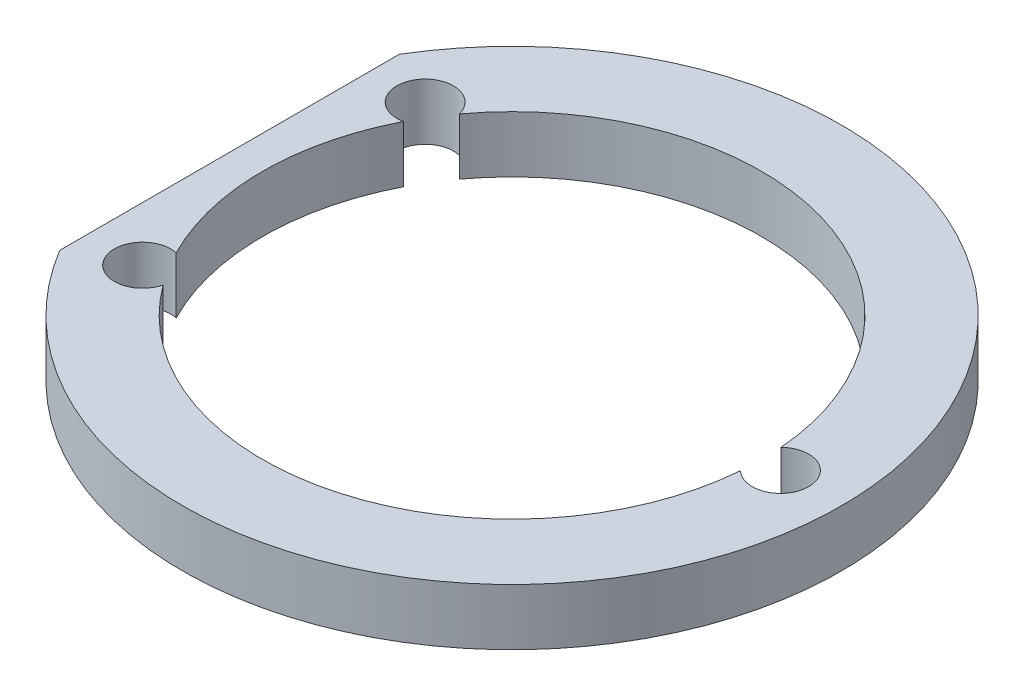
ISO-10303-21;
HEADER;
FILE_DESCRIPTION(('STEP AP214'),'2;1');
FILE_NAME('part.step','',(''),(''),'','','');
FILE_SCHEMA(('AUTOMOTIVE_DESIGN { 1 0 10303 214 1 1 1 1 }'));
ENDSEC;
DATA;
#1=APPLICATION_CONTEXT('core data for automotive mechanical design processes');
#2=APPLICATION_PROTOCOL_DEFINITION('international standard','automotive_design',2000,#1);
#3=PRODUCT_CONTEXT('',#1,'mechanical');
#4=PRODUCT('Part','Part','',(#3));
#5=PRODUCT_RELATED_PRODUCT_CATEGORY('part','',(#4));
#6=PRODUCT_DEFINITION_FORMATION('','',#4);
#7=PRODUCT_DEFINITION_CONTEXT('part definition',#1,'design');
#8=PRODUCT_DEFINITION('design','',#6,#7);
#9=PRODUCT_DEFINITION_SHAPE('','',#8);
#10=(LENGTH_UNIT() NAMED_UNIT(*) SI_UNIT(.MILLI.,.METRE.));
#11=(NAMED_UNIT(*) PLANE_ANGLE_UNIT() SI_UNIT($,.RADIAN.));
#12=(NAMED_UNIT(*) SI_UNIT($,.STERADIAN.) SOLID_ANGLE_UNIT());
#13=UNCERTAINTY_MEASURE_WITH_UNIT(LENGTH_MEASURE(1.E-05),#10,'distance_accuracy_value','');
#14=(GEOMETRIC_REPRESENTATION_CONTEXT(3) GLOBAL_UNCERTAINTY_ASSIGNED_CONTEXT((#13)) GLOBAL_UNIT_ASSIGNED_CONTEXT((#10,
#11,#12)) REPRESENTATION_CONTEXT('',''));
#15=CARTESIAN_POINT('',(0.,0.,0.));
#16=DIRECTION('',(0.,0.,1.));
#17=DIRECTION('',(1.,0.,0.));
#18=AXIS2_PLACEMENT_3D('',#15,#16,#17);
#19=CARTESIAN_POINT('',(0.,6.,0.));
#20=DIRECTION('',(0.,1.,0.));
#21=DIRECTION('',(0.,0.,1.));
#22=AXIS2_PLACEMENT_3D('',#19,#20,#21);
#23=PLANE('',#22);
#24=CARTESIAN_POINT('',(0.,6.,0.));
#25=DIRECTION('',(0.,1.,0.));
#26=DIRECTION('',(0.,0.,1.));
#27=AXIS2_PLACEMENT_3D('',#24,#25,#26);
#28=CIRCLE('',#27,35.);
#29=CARTESIAN_POINT('',(-30.,6.,18.02775637732));
#30=VERTEX_POINT('',#29);
#31=CARTESIAN_POINT('',(-30.,6.,-18.02775637732));
#32=VERTEX_POINT('',#31);
#33=EDGE_CURVE('E148',#30,#32,#28,.T.);
#34=ORIENTED_EDGE('',*,*,#33,.T.);
#35=DIRECTION('',(0.,0.,1.));
#36=VECTOR('',#35,1.);
#37=CARTESIAN_POINT('',(-30.,6.,-18.02775637732));
#38=LINE('',#37,#36);
#39=EDGE_CURVE('E151',#32,#30,#38,.T.);
#40=ORIENTED_EDGE('',*,*,#39,.T.);
#41=EDGE_LOOP('',(#34,#40));
#42=FACE_BOUND('',#41,.T.);
#43=CARTESIAN_POINT('',(-24.2332416321053,6.,-15.));
#44=DIRECTION('',(0.,1.,0.));
#45=DIRECTION('',(0.,0.,1.));
#46=AXIS2_PLACEMENT_3D('',#43,#44,#45);
#47=CIRCLE('',#46,3.);
#48=CARTESIAN_POINT('',(-21.3241831364564,6.,-15.7330611631325));
#49=VERTEX_POINT('',#48);
#50=CARTESIAN_POINT('',(-23.5919698670948,6.,-12.0693395755563));
#51=VERTEX_POINT('',#50);
#52=EDGE_CURVE('E105',#49,#51,#47,.T.);
#53=ORIENTED_EDGE('',*,*,#52,.F.);
#54=CARTESIAN_POINT('',(0.,6.,0.));
#55=DIRECTION('',(0.,1.,0.));
#56=DIRECTION('',(0.,0.,1.));
#57=AXIS2_PLACEMENT_3D('',#54,#55,#56);
#58=CIRCLE('',#57,26.5);
#59=CARTESIAN_POINT('',(26.4122807017544,6.,-2.15439739410649));
#60=VERTEX_POINT('',#59);
#61=EDGE_CURVE('E97',#60,#49,#58,.T.);
#62=ORIENTED_EDGE('',*,*,#61,.F.);
#63=CARTESIAN_POINT('',(28.5,6.,0.));
#64=DIRECTION('',(0.,1.,0.));
#65=DIRECTION('',(0.,0.,1.));
#66=AXIS2_PLACEMENT_3D('',#63,#64,#65);
#67=CIRCLE('',#66,3.);
#68=CARTESIAN_POINT('',(26.4122807017544,6.,2.15439739410649));
#69=VERTEX_POINT('',#68);
#70=EDGE_CURVE('E126',#69,#60,#67,.T.);
#71=ORIENTED_EDGE('',*,*,#70,.F.);
#72=CARTESIAN_POINT('',(0.,6.,0.));
#73=DIRECTION('',(0.,1.,0.));
#74=DIRECTION('',(0.,0.,1.));
#75=AXIS2_PLACEMENT_3D('',#72,#73,#74);
#76=CIRCLE('',#75,26.5);
#77=CARTESIAN_POINT('',(-21.3241831364564,6.,15.7330611631325));
#78=VERTEX_POINT('',#77);
#79=EDGE_CURVE('E124',#78,#69,#76,.T.);
#80=ORIENTED_EDGE('',*,*,#79,.F.);
#81=CARTESIAN_POINT('',(-24.2332416321053,6.,15.));
#82=DIRECTION('',(0.,1.,0.));
#83=DIRECTION('',(0.,0.,-1.));
#84=AXIS2_PLACEMENT_3D('',#81,#82,#83);
#85=CIRCLE('',#84,3.);
#86=CARTESIAN_POINT('',(-23.5919698670948,6.,12.0693395755563));
#87=VERTEX_POINT('',#86);
#88=EDGE_CURVE('E120',#87,#78,#85,.T.);
#89=ORIENTED_EDGE('',*,*,#88,.F.);
#90=CARTESIAN_POINT('',(0.,6.,0.));
#91=DIRECTION('',(0.,1.,0.));
#92=DIRECTION('',(0.,0.,1.));
#93=AXIS2_PLACEMENT_3D('',#90,#91,#92);
#94=CIRCLE('',#93,26.5);
#95=EDGE_CURVE('E118',#51,#87,#94,.T.);
#96=ORIENTED_EDGE('',*,*,#95,.F.);
#97=EDGE_LOOP('',(#53,#62,#71,#80,#89,#96));
#98=FACE_BOUND('',#97,.T.);
#99=ADVANCED_FACE('F32',(#42,#98),#23,.T.);
#100=CARTESIAN_POINT('',(0.,0.,0.));
#101=DIRECTION('',(0.,1.,0.));
#102=DIRECTION('',(0.,0.,1.));
#103=AXIS2_PLACEMENT_3D('',#100,#101,#102);
#104=PLANE('',#103);
#105=CARTESIAN_POINT('',(0.,0.,0.));
#106=DIRECTION('',(0.,1.,0.));
#107=DIRECTION('',(0.,0.,1.));
#108=AXIS2_PLACEMENT_3D('',#105,#106,#107);
#109=CIRCLE('',#108,35.);
#110=CARTESIAN_POINT('',(-30.,0.,18.02775637732));
#111=VERTEX_POINT('',#110);
#112=CARTESIAN_POINT('',(-30.,0.,-18.02775637732));
#113=VERTEX_POINT('',#112);
#114=EDGE_CURVE('E113',#111,#113,#109,.T.);
#115=ORIENTED_EDGE('',*,*,#114,.F.);
#116=DIRECTION('',(0.,0.,1.));
#117=VECTOR('',#116,1.);
#118=CARTESIAN_POINT('',(-30.,0.,-18.02775637732));
#119=LINE('',#118,#117);
#120=EDGE_CURVE('E152',#113,#111,#119,.T.);
#121=ORIENTED_EDGE('',*,*,#120,.F.);
#122=EDGE_LOOP('',(#115,#121));
#123=FACE_BOUND('',#122,.T.);
#124=CARTESIAN_POINT('',(0.,0.,0.));
#125=DIRECTION('',(0.,1.,0.));
#126=DIRECTION('',(0.,0.,1.));
#127=AXIS2_PLACEMENT_3D('',#124,#125,#126);
#128=CIRCLE('',#127,26.5);
#129=CARTESIAN_POINT('',(26.4122807017544,0.,-2.15439739410649));
#130=VERTEX_POINT('',#129);
#131=CARTESIAN_POINT('',(-21.3241831364564,0.,-15.7330611631325));
#132=VERTEX_POINT('',#131);
#133=EDGE_CURVE('E55',#130,#132,#128,.T.);
#134=ORIENTED_EDGE('',*,*,#133,.T.);
#135=CARTESIAN_POINT('',(-24.2332416321053,0.,-15.));
#136=DIRECTION('',(0.,1.,0.));
#137=DIRECTION('',(0.,0.,1.));
#138=AXIS2_PLACEMENT_3D('',#135,#136,#137);
#139=CIRCLE('',#138,3.);
#140=CARTESIAN_POINT('',(-23.5919698670948,0.,-12.0693395755563));
#141=VERTEX_POINT('',#140);
#142=EDGE_CURVE('E112',#132,#141,#139,.T.);
#143=ORIENTED_EDGE('',*,*,#142,.T.);
#144=CARTESIAN_POINT('',(0.,0.,0.));
#145=DIRECTION('',(0.,1.,0.));
#146=DIRECTION('',(0.,0.,1.));
#147=AXIS2_PLACEMENT_3D('',#144,#145,#146);
#148=CIRCLE('',#147,26.5);
#149=CARTESIAN_POINT('',(-23.5919698670948,0.,12.0693395755563));
#150=VERTEX_POINT('',#149);
#151=EDGE_CURVE('E130',#141,#150,#148,.T.);
#152=ORIENTED_EDGE('',*,*,#151,.T.);
#153=CARTESIAN_POINT('',(-24.2332416321053,0.,15.));
#154=DIRECTION('',(0.,1.,0.));
#155=DIRECTION('',(0.,0.,-1.));
#156=AXIS2_PLACEMENT_3D('',#153,#154,#155);
#157=CIRCLE('',#156,3.);
#158=CARTESIAN_POINT('',(-21.3241831364564,0.,15.7330611631325));
#159=VERTEX_POINT('',#158);
#160=EDGE_CURVE('E133',#150,#159,#157,.T.);
#161=ORIENTED_EDGE('',*,*,#160,.T.);
#162=CARTESIAN_POINT('',(0.,0.,0.));
#163=DIRECTION('',(0.,1.,0.));
#164=DIRECTION('',(0.,0.,1.));
#165=AXIS2_PLACEMENT_3D('',#162,#163,#164);
#166=CIRCLE('',#165,26.5);
#167=CARTESIAN_POINT('',(26.4122807017544,0.,2.15439739410649));
#168=VERTEX_POINT('',#167);
#169=EDGE_CURVE('E136',#159,#168,#166,.T.);
#170=ORIENTED_EDGE('',*,*,#169,.T.);
#171=CARTESIAN_POINT('',(28.5,0.,0.));
#172=DIRECTION('',(0.,1.,0.));
#173=DIRECTION('',(0.,0.,1.));
#174=AXIS2_PLACEMENT_3D('',#171,#172,#173);
#175=CIRCLE('',#174,3.);
#176=EDGE_CURVE('E106',#168,#130,#175,.T.);
#177=ORIENTED_EDGE('',*,*,#176,.T.);
#178=EDGE_LOOP('',(#134,#143,#152,#161,#170,#177));
#179=FACE_BOUND('',#178,.T.);
#180=ADVANCED_FACE('F164',(#123,#179),#104,.F.);
#181=CARTESIAN_POINT('',(0.,6.,0.));
#182=DIRECTION('',(0.,-1.,0.));
#183=DIRECTION('',(0.,0.,-1.));
#184=AXIS2_PLACEMENT_3D('',#181,#182,#183);
#185=CYLINDRICAL_SURFACE('',#184,35.);
#186=ORIENTED_EDGE('',*,*,#114,.T.);
#187=DIRECTION('',(0.,-1.,0.));
#188=VECTOR('',#187,1.);
#189=CARTESIAN_POINT('',(-30.,6.,-18.02775637732));
#190=LINE('',#189,#188);
#191=EDGE_CURVE('E11',#32,#113,#190,.T.);
#192=ORIENTED_EDGE('',*,*,#191,.F.);
#193=ORIENTED_EDGE('',*,*,#33,.F.);
#194=DIRECTION('',(0.,-1.,0.));
#195=VECTOR('',#194,1.);
#196=CARTESIAN_POINT('',(-30.,6.,18.02775637732));
#197=LINE('',#196,#195);
#198=EDGE_CURVE('E40',#30,#111,#197,.T.);
#199=ORIENTED_EDGE('',*,*,#198,.T.);
#200=EDGE_LOOP('',(#186,#192,#193,#199));
#201=FACE_BOUND('',#200,.T.);
#202=ADVANCED_FACE('F34',(#201),#185,.T.);
#203=CARTESIAN_POINT('',(-30.,6.,-18.02775637732));
#204=DIRECTION('',(1.,0.,0.));
#205=DIRECTION('',(0.,0.,-1.));
#206=AXIS2_PLACEMENT_3D('',#203,#204,#205);
#207=PLANE('',#206);
#208=ORIENTED_EDGE('',*,*,#120,.T.);
#209=ORIENTED_EDGE('',*,*,#198,.F.);
#210=ORIENTED_EDGE('',*,*,#39,.F.);
#211=ORIENTED_EDGE('',*,*,#191,.T.);
#212=EDGE_LOOP('',(#208,#209,#210,#211));
#213=FACE_BOUND('',#212,.T.);
#214=ADVANCED_FACE('F166',(#213),#207,.F.);
#215=CARTESIAN_POINT('',(0.,6.,0.));
#216=DIRECTION('',(0.,-1.,0.));
#217=DIRECTION('',(0.,0.,-1.));
#218=AXIS2_PLACEMENT_3D('',#215,#216,#217);
#219=CYLINDRICAL_SURFACE('',#218,26.5);
#220=ORIENTED_EDGE('',*,*,#133,.F.);
#221=DIRECTION('',(0.,-1.,0.));
#222=VECTOR('',#221,1.);
#223=CARTESIAN_POINT('',(26.4122807017544,6.,-2.15439739410649));
#224=LINE('',#223,#222);
#225=EDGE_CURVE('E101',#60,#130,#224,.T.);
#226=ORIENTED_EDGE('',*,*,#225,.F.);
#227=ORIENTED_EDGE('',*,*,#61,.T.);
#228=DIRECTION('',(0.,-1.,0.));
#229=VECTOR('',#228,1.);
#230=CARTESIAN_POINT('',(-21.3241831364564,6.,-15.7330611631325));
#231=LINE('',#230,#229);
#232=EDGE_CURVE('E100',#49,#132,#231,.T.);
#233=ORIENTED_EDGE('',*,*,#232,.T.);
#234=EDGE_LOOP('',(#220,#226,#227,#233));
#235=FACE_BOUND('',#234,.T.);
#236=ADVANCED_FACE('F99',(#235),#219,.F.);
#237=CARTESIAN_POINT('',(-24.2332416321053,6.,-15.));
#238=DIRECTION('',(0.,-1.,0.));
#239=DIRECTION('',(0.,0.,-1.));
#240=AXIS2_PLACEMENT_3D('',#237,#238,#239);
#241=CYLINDRICAL_SURFACE('',#240,3.);
#242=ORIENTED_EDGE('',*,*,#142,.F.);
#243=ORIENTED_EDGE('',*,*,#232,.F.);
#244=ORIENTED_EDGE('',*,*,#52,.T.);
#245=DIRECTION('',(0.,-1.,0.));
#246=VECTOR('',#245,1.);
#247=CARTESIAN_POINT('',(-23.5919698670948,6.,-12.0693395755563));
#248=LINE('',#247,#246);
#249=EDGE_CURVE('E114',#51,#141,#248,.T.);
#250=ORIENTED_EDGE('',*,*,#249,.T.);
#251=EDGE_LOOP('',(#242,#243,#244,#250));
#252=FACE_BOUND('',#251,.T.);
#253=ADVANCED_FACE('F109',(#252),#241,.F.);
#254=CARTESIAN_POINT('',(0.,6.,0.));
#255=DIRECTION('',(0.,-1.,0.));
#256=DIRECTION('',(0.,0.,-1.));
#257=AXIS2_PLACEMENT_3D('',#254,#255,#256);
#258=CYLINDRICAL_SURFACE('',#257,26.5);
#259=ORIENTED_EDGE('',*,*,#151,.F.);
#260=ORIENTED_EDGE('',*,*,#249,.F.);
#261=ORIENTED_EDGE('',*,*,#95,.T.);
#262=DIRECTION('',(0.,-1.,0.));
#263=VECTOR('',#262,1.);
#264=CARTESIAN_POINT('',(-23.5919698670948,6.,12.0693395755563));
#265=LINE('',#264,#263);
#266=EDGE_CURVE('E145',#87,#150,#265,.T.);
#267=ORIENTED_EDGE('',*,*,#266,.T.);
#268=EDGE_LOOP('',(#259,#260,#261,#267));
#269=FACE_BOUND('',#268,.T.);
#270=ADVANCED_FACE('F212',(#269),#258,.F.);
#271=CARTESIAN_POINT('',(-24.2332416321053,6.,15.));
#272=DIRECTION('',(0.,-1.,0.));
#273=DIRECTION('',(0.,0.,-1.));
#274=AXIS2_PLACEMENT_3D('',#271,#272,#273);
#275=CYLINDRICAL_SURFACE('',#274,3.);
#276=ORIENTED_EDGE('',*,*,#160,.F.);
#277=ORIENTED_EDGE('',*,*,#266,.F.);
#278=ORIENTED_EDGE('',*,*,#88,.T.);
#279=DIRECTION('',(0.,-1.,0.));
#280=VECTOR('',#279,1.);
#281=CARTESIAN_POINT('',(-21.3241831364564,6.,15.7330611631325));
#282=LINE('',#281,#280);
#283=EDGE_CURVE('E143',#78,#159,#282,.T.);
#284=ORIENTED_EDGE('',*,*,#283,.T.);
#285=EDGE_LOOP('',(#276,#277,#278,#284));
#286=FACE_BOUND('',#285,.T.);
#287=ADVANCED_FACE('F219',(#286),#275,.F.);
#288=CARTESIAN_POINT('',(0.,6.,0.));
#289=DIRECTION('',(0.,-1.,0.));
#290=DIRECTION('',(0.,0.,-1.));
#291=AXIS2_PLACEMENT_3D('',#288,#289,#290);
#292=CYLINDRICAL_SURFACE('',#291,26.5);
#293=ORIENTED_EDGE('',*,*,#169,.F.);
#294=ORIENTED_EDGE('',*,*,#283,.F.);
#295=ORIENTED_EDGE('',*,*,#79,.T.);
#296=DIRECTION('',(0.,-1.,0.));
#297=VECTOR('',#296,1.);
#298=CARTESIAN_POINT('',(26.4122807017544,6.,2.15439739410649));
#299=LINE('',#298,#297);
#300=EDGE_CURVE('E47',#69,#168,#299,.T.);
#301=ORIENTED_EDGE('',*,*,#300,.T.);
#302=EDGE_LOOP('',(#293,#294,#295,#301));
#303=FACE_BOUND('',#302,.T.);
#304=ADVANCED_FACE('F228',(#303),#292,.F.);
#305=CARTESIAN_POINT('',(28.5,6.,0.));
#306=DIRECTION('',(0.,-1.,0.));
#307=DIRECTION('',(0.,0.,-1.));
#308=AXIS2_PLACEMENT_3D('',#305,#306,#307);
#309=CYLINDRICAL_SURFACE('',#308,3.);
#310=ORIENTED_EDGE('',*,*,#176,.F.);
#311=ORIENTED_EDGE('',*,*,#300,.F.);
#312=ORIENTED_EDGE('',*,*,#70,.T.);
#313=ORIENTED_EDGE('',*,*,#225,.T.);
#314=EDGE_LOOP('',(#310,#311,#312,#313));
#315=FACE_BOUND('',#314,.T.);
#316=ADVANCED_FACE('F237',(#315),#309,.F.);
#317=CLOSED_SHELL('',(#99,#180,#202,#214,#236,#253,#270,#287,#304,#316));
#318=MANIFOLD_SOLID_BREP('B2',#317);
#319=ADVANCED_BREP_SHAPE_REPRESENTATION('',(#18,#318),#14);
#320=SHAPE_DEFINITION_REPRESENTATION(#9,#319);
ENDSEC;
END-ISO-10303-21;
